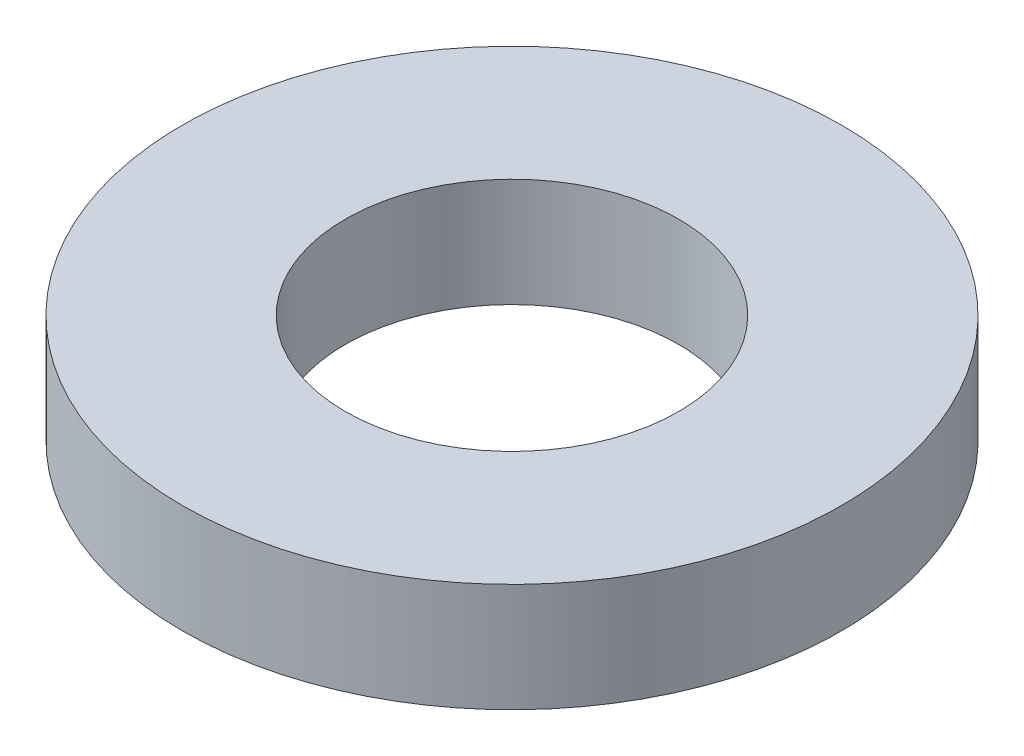
ISO-10303-21;
HEADER;
FILE_DESCRIPTION(('STEP AP214'),'2;1');
FILE_NAME('part.step','',(''),(''),'','','');
FILE_SCHEMA(('AUTOMOTIVE_DESIGN { 1 0 10303 214 1 1 1 1 }'));
ENDSEC;
DATA;
#1=APPLICATION_CONTEXT('core data for automotive mechanical design processes');
#2=APPLICATION_PROTOCOL_DEFINITION('international standard','automotive_design',2000,#1);
#3=PRODUCT_CONTEXT('',#1,'mechanical');
#4=PRODUCT('Part','Part','',(#3));
#5=PRODUCT_RELATED_PRODUCT_CATEGORY('part','',(#4));
#6=PRODUCT_DEFINITION_FORMATION('','',#4);
#7=PRODUCT_DEFINITION_CONTEXT('part definition',#1,'design');
#8=PRODUCT_DEFINITION('design','',#6,#7);
#9=PRODUCT_DEFINITION_SHAPE('','',#8);
#10=(LENGTH_UNIT() NAMED_UNIT(*) SI_UNIT(.MILLI.,.METRE.));
#11=(NAMED_UNIT(*) PLANE_ANGLE_UNIT() SI_UNIT($,.RADIAN.));
#12=(NAMED_UNIT(*) SI_UNIT($,.STERADIAN.) SOLID_ANGLE_UNIT());
#13=UNCERTAINTY_MEASURE_WITH_UNIT(LENGTH_MEASURE(1.E-05),#10,'distance_accuracy_value','');
#14=(GEOMETRIC_REPRESENTATION_CONTEXT(3) GLOBAL_UNCERTAINTY_ASSIGNED_CONTEXT((#13)) GLOBAL_UNIT_ASSIGNED_CONTEXT((#10,
#11,#12)) REPRESENTATION_CONTEXT('',''));
#15=CARTESIAN_POINT('',(0.,0.,0.));
#16=DIRECTION('',(0.,0.,1.));
#17=DIRECTION('',(1.,0.,0.));
#18=AXIS2_PLACEMENT_3D('',#15,#16,#17);
#19=CARTESIAN_POINT('',(0.,1.4,0.));
#20=DIRECTION('',(0.,1.,0.));
#21=DIRECTION('',(0.,0.,1.));
#22=AXIS2_PLACEMENT_3D('',#19,#20,#21);
#23=PLANE('',#22);
#24=CARTESIAN_POINT('',(0.,1.4,0.));
#25=DIRECTION('',(0.,1.,0.));
#26=DIRECTION('',(0.,0.,1.));
#27=AXIS2_PLACEMENT_3D('',#24,#25,#26);
#28=CIRCLE('',#27,4.25);
#29=CARTESIAN_POINT('',(0.,1.4,4.25));
#30=VERTEX_POINT('',#29);
#31=EDGE_CURVE('E10',#30,#30,#28,.T.);
#32=ORIENTED_EDGE('',*,*,#31,.T.);
#33=EDGE_LOOP('',(#32));
#34=FACE_BOUND('',#33,.T.);
#35=CARTESIAN_POINT('',(0.,1.4,0.));
#36=DIRECTION('',(0.,1.,0.));
#37=DIRECTION('',(0.,0.,1.));
#38=AXIS2_PLACEMENT_3D('',#35,#36,#37);
#39=CIRCLE('',#38,2.15);
#40=CARTESIAN_POINT('',(0.,1.4,2.15));
#41=VERTEX_POINT('',#40);
#42=EDGE_CURVE('E44',#41,#41,#39,.T.);
#43=ORIENTED_EDGE('',*,*,#42,.F.);
#44=EDGE_LOOP('',(#43));
#45=FACE_BOUND('',#44,.T.);
#46=ADVANCED_FACE('F33',(#34,#45),#23,.T.);
#47=CARTESIAN_POINT('',(0.,0.,0.));
#48=DIRECTION('',(0.,1.,0.));
#49=DIRECTION('',(0.,0.,1.));
#50=AXIS2_PLACEMENT_3D('',#47,#48,#49);
#51=PLANE('',#50);
#52=CARTESIAN_POINT('',(0.,0.,0.));
#53=DIRECTION('',(0.,1.,0.));
#54=DIRECTION('',(0.,0.,1.));
#55=AXIS2_PLACEMENT_3D('',#52,#53,#54);
#56=CIRCLE('',#55,4.25);
#57=CARTESIAN_POINT('',(0.,0.,4.25));
#58=VERTEX_POINT('',#57);
#59=EDGE_CURVE('E37',#58,#58,#56,.T.);
#60=ORIENTED_EDGE('',*,*,#59,.F.);
#61=EDGE_LOOP('',(#60));
#62=FACE_BOUND('',#61,.T.);
#63=CARTESIAN_POINT('',(0.,0.,0.));
#64=DIRECTION('',(0.,1.,0.));
#65=DIRECTION('',(0.,0.,1.));
#66=AXIS2_PLACEMENT_3D('',#63,#64,#65);
#67=CIRCLE('',#66,2.15);
#68=CARTESIAN_POINT('',(0.,0.,2.15));
#69=VERTEX_POINT('',#68);
#70=EDGE_CURVE('E46',#69,#69,#67,.T.);
#71=ORIENTED_EDGE('',*,*,#70,.T.);
#72=EDGE_LOOP('',(#71));
#73=FACE_BOUND('',#72,.T.);
#74=ADVANCED_FACE('F56',(#62,#73),#51,.F.);
#75=CARTESIAN_POINT('',(0.,1.4,0.));
#76=DIRECTION('',(0.,-1.,0.));
#77=DIRECTION('',(0.,0.,-1.));
#78=AXIS2_PLACEMENT_3D('',#75,#76,#77);
#79=CYLINDRICAL_SURFACE('',#78,4.25);
#80=ORIENTED_EDGE('',*,*,#31,.F.);
#81=EDGE_LOOP('',(#80));
#82=FACE_BOUND('',#81,.T.);
#83=ORIENTED_EDGE('',*,*,#59,.T.);
#84=EDGE_LOOP('',(#83));
#85=FACE_BOUND('',#84,.T.);
#86=ADVANCED_FACE('F35',(#82,#85),#79,.T.);
#87=CARTESIAN_POINT('',(0.,1.4,0.));
#88=DIRECTION('',(0.,-1.,0.));
#89=DIRECTION('',(0.,0.,-1.));
#90=AXIS2_PLACEMENT_3D('',#87,#88,#89);
#91=CYLINDRICAL_SURFACE('',#90,2.15);
#92=ORIENTED_EDGE('',*,*,#42,.T.);
#93=EDGE_LOOP('',(#92));
#94=FACE_BOUND('',#93,.T.);
#95=ORIENTED_EDGE('',*,*,#70,.F.);
#96=EDGE_LOOP('',(#95));
#97=FACE_BOUND('',#96,.T.);
#98=ADVANCED_FACE('F52',(#94,#97),#91,.F.);
#99=CLOSED_SHELL('',(#46,#74,#86,#98));
#100=MANIFOLD_SOLID_BREP('B2',#99);
#101=ADVANCED_BREP_SHAPE_REPRESENTATION('',(#18,#100),#14);
#102=SHAPE_DEFINITION_REPRESENTATION(#9,#101);
ENDSEC;
END-ISO-10303-21;
